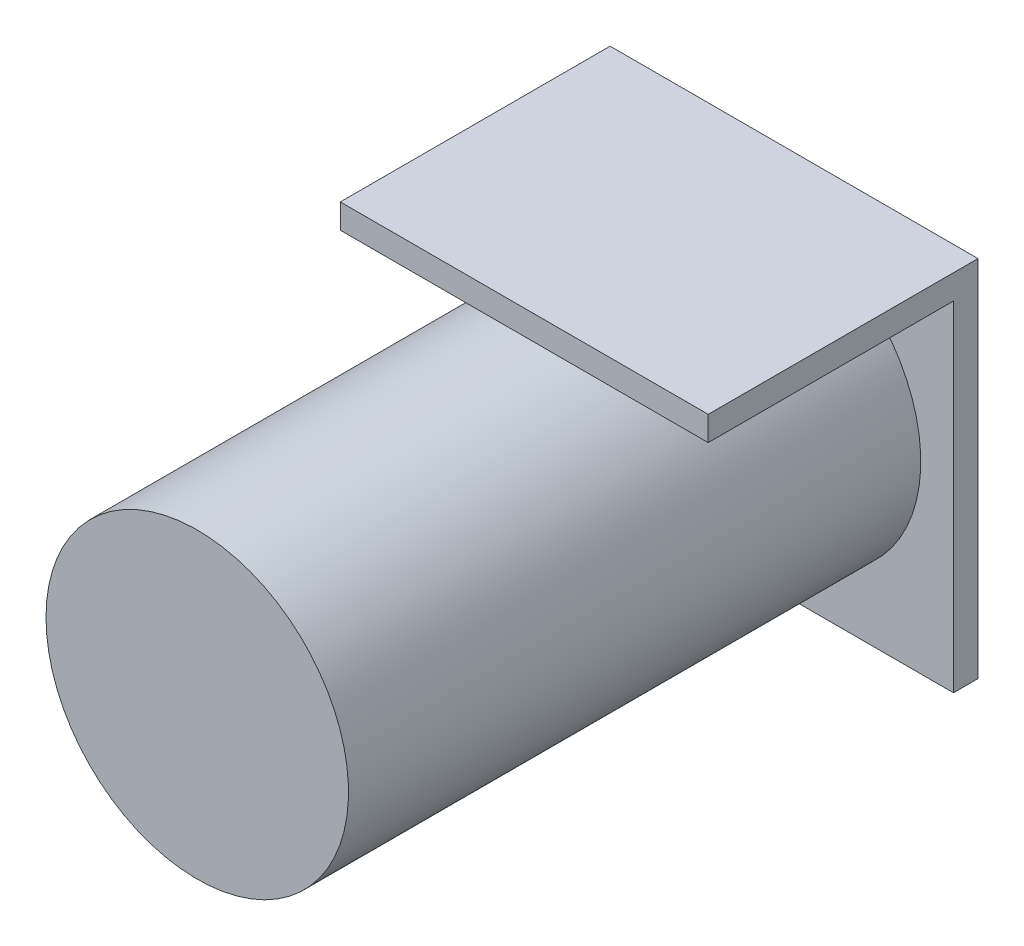
ISO-10303-21;
HEADER;
FILE_DESCRIPTION(('STEP AP214'),'2;1');
FILE_NAME('part.step','',(''),(''),'','','');
FILE_SCHEMA(('AUTOMOTIVE_DESIGN { 1 0 10303 214 1 1 1 1 }'));
ENDSEC;
DATA;
#1=APPLICATION_CONTEXT('core data for automotive mechanical design processes');
#2=APPLICATION_PROTOCOL_DEFINITION('international standard','automotive_design',2000,#1);
#3=PRODUCT_CONTEXT('',#1,'mechanical');
#4=PRODUCT('Part','Part','',(#3));
#5=PRODUCT_RELATED_PRODUCT_CATEGORY('part','',(#4));
#6=PRODUCT_DEFINITION_FORMATION('','',#4);
#7=PRODUCT_DEFINITION_CONTEXT('part definition',#1,'design');
#8=PRODUCT_DEFINITION('design','',#6,#7);
#9=PRODUCT_DEFINITION_SHAPE('','',#8);
#10=(LENGTH_UNIT() NAMED_UNIT(*) SI_UNIT(.MILLI.,.METRE.));
#11=(NAMED_UNIT(*) PLANE_ANGLE_UNIT() SI_UNIT($,.RADIAN.));
#12=(NAMED_UNIT(*) SI_UNIT($,.STERADIAN.) SOLID_ANGLE_UNIT());
#13=UNCERTAINTY_MEASURE_WITH_UNIT(LENGTH_MEASURE(1.E-05),#10,'distance_accuracy_value','');
#14=(GEOMETRIC_REPRESENTATION_CONTEXT(3) GLOBAL_UNCERTAINTY_ASSIGNED_CONTEXT((#13)) GLOBAL_UNIT_ASSIGNED_CONTEXT((#10,
#11,#12)) REPRESENTATION_CONTEXT('',''));
#15=CARTESIAN_POINT('',(0.,0.,0.));
#16=DIRECTION('',(0.,0.,1.));
#17=DIRECTION('',(1.,0.,0.));
#18=AXIS2_PLACEMENT_3D('',#15,#16,#17);
#19=CARTESIAN_POINT('',(22.5,-22.5,0.));
#20=DIRECTION('',(0.,0.,-1.));
#21=DIRECTION('',(-1.,0.,0.));
#22=AXIS2_PLACEMENT_3D('',#19,#20,#21);
#23=PLANE('',#22);
#24=CARTESIAN_POINT('',(0.,0.,0.));
#25=DIRECTION('',(0.,0.,-1.));
#26=DIRECTION('',(-1.,0.,0.));
#27=AXIS2_PLACEMENT_3D('',#24,#25,#26);
#28=CIRCLE('',#27,18.5);
#29=CARTESIAN_POINT('',(-18.5,0.,0.));
#30=VERTEX_POINT('',#29);
#31=EDGE_CURVE('E150',#30,#30,#28,.T.);
#32=ORIENTED_EDGE('',*,*,#31,.T.);
#33=EDGE_LOOP('',(#32));
#34=FACE_BOUND('',#33,.T.);
#35=DIRECTION('',(1.,0.,0.));
#36=VECTOR('',#35,1.);
#37=CARTESIAN_POINT('',(22.5,19.,0.));
#38=LINE('',#37,#36);
#39=CARTESIAN_POINT('',(-22.5,19.,0.));
#40=VERTEX_POINT('',#39);
#41=CARTESIAN_POINT('',(22.5,19.,0.));
#42=VERTEX_POINT('',#41);
#43=EDGE_CURVE('E11',#40,#42,#38,.T.);
#44=ORIENTED_EDGE('',*,*,#43,.F.);
#45=DIRECTION('',(0.,-1.,0.));
#46=VECTOR('',#45,1.);
#47=CARTESIAN_POINT('',(-22.5,-22.5,0.));
#48=LINE('',#47,#46);
#49=CARTESIAN_POINT('',(-22.5,-22.5,0.));
#50=VERTEX_POINT('',#49);
#51=EDGE_CURVE('E137',#40,#50,#48,.T.);
#52=ORIENTED_EDGE('',*,*,#51,.T.);
#53=DIRECTION('',(-1.,0.,0.));
#54=VECTOR('',#53,1.);
#55=CARTESIAN_POINT('',(22.5,-22.5,0.));
#56=LINE('',#55,#54);
#57=CARTESIAN_POINT('',(22.5,-22.5,0.));
#58=VERTEX_POINT('',#57);
#59=EDGE_CURVE('E136',#58,#50,#56,.T.);
#60=ORIENTED_EDGE('',*,*,#59,.F.);
#61=DIRECTION('',(0.,-1.,0.));
#62=VECTOR('',#61,1.);
#63=CARTESIAN_POINT('',(22.5,-22.5,0.));
#64=LINE('',#63,#62);
#65=EDGE_CURVE('E104',#42,#58,#64,.T.);
#66=ORIENTED_EDGE('',*,*,#65,.F.);
#67=EDGE_LOOP('',(#44,#52,#60,#66));
#68=FACE_BOUND('',#67,.T.);
#69=ADVANCED_FACE('F39',(#34,#68),#23,.F.);
#70=CARTESIAN_POINT('',(0.,0.,-23.));
#71=DIRECTION('',(0.,0.,-1.));
#72=DIRECTION('',(-1.,0.,0.));
#73=AXIS2_PLACEMENT_3D('',#70,#71,#72);
#74=CYLINDRICAL_SURFACE('',#73,3.);
#75=CARTESIAN_POINT('',(0.,0.,-18.));
#76=DIRECTION('',(0.,0.,-1.));
#77=DIRECTION('',(-1.,0.,0.));
#78=AXIS2_PLACEMENT_3D('',#75,#76,#77);
#79=CIRCLE('',#78,3.);
#80=CARTESIAN_POINT('',(-3.,0.,-18.));
#81=VERTEX_POINT('',#80);
#82=EDGE_CURVE('E147',#81,#81,#79,.T.);
#83=ORIENTED_EDGE('',*,*,#82,.F.);
#84=EDGE_LOOP('',(#83));
#85=FACE_BOUND('',#84,.T.);
#86=CARTESIAN_POINT('',(0.,0.,-3.));
#87=DIRECTION('',(0.,0.,1.));
#88=DIRECTION('',(1.,0.,0.));
#89=AXIS2_PLACEMENT_3D('',#86,#87,#88);
#90=CIRCLE('',#89,3.);
#91=CARTESIAN_POINT('',(3.,0.,-3.));
#92=VERTEX_POINT('',#91);
#93=EDGE_CURVE('E50',#92,#92,#90,.T.);
#94=ORIENTED_EDGE('',*,*,#93,.F.);
#95=EDGE_LOOP('',(#94));
#96=FACE_BOUND('',#95,.T.);
#97=ADVANCED_FACE('F160',(#85,#96),#74,.T.);
#98=CARTESIAN_POINT('',(0.,0.,-18.));
#99=DIRECTION('',(0.,0.,1.));
#100=DIRECTION('',(1.,0.,0.));
#101=AXIS2_PLACEMENT_3D('',#98,#99,#100);
#102=PLANE('',#101);
#103=ORIENTED_EDGE('',*,*,#82,.T.);
#104=EDGE_LOOP('',(#103));
#105=FACE_BOUND('',#104,.T.);
#106=ADVANCED_FACE('F41',(#105),#102,.F.);
#107=CARTESIAN_POINT('',(22.5,22.,-3.));
#108=DIRECTION('',(0.,0.,1.));
#109=DIRECTION('',(1.,0.,0.));
#110=AXIS2_PLACEMENT_3D('',#107,#108,#109);
#111=PLANE('',#110);
#112=DIRECTION('',(-1.,0.,0.));
#113=VECTOR('',#112,1.);
#114=CARTESIAN_POINT('',(22.5,22.,-3.));
#115=LINE('',#114,#113);
#116=CARTESIAN_POINT('',(22.5,22.,-3.));
#117=VERTEX_POINT('',#116);
#118=CARTESIAN_POINT('',(-22.5,22.,-3.));
#119=VERTEX_POINT('',#118);
#120=EDGE_CURVE('E142',#117,#119,#115,.T.);
#121=ORIENTED_EDGE('',*,*,#120,.F.);
#122=DIRECTION('',(0.,1.,0.));
#123=VECTOR('',#122,1.);
#124=CARTESIAN_POINT('',(22.5,22.,-3.));
#125=LINE('',#124,#123);
#126=CARTESIAN_POINT('',(22.5,-22.5,-3.));
#127=VERTEX_POINT('',#126);
#128=EDGE_CURVE('E82',#127,#117,#125,.T.);
#129=ORIENTED_EDGE('',*,*,#128,.F.);
#130=DIRECTION('',(-1.,0.,0.));
#131=VECTOR('',#130,1.);
#132=CARTESIAN_POINT('',(22.5,-22.5,-3.));
#133=LINE('',#132,#131);
#134=CARTESIAN_POINT('',(-22.5,-22.5,-3.));
#135=VERTEX_POINT('',#134);
#136=EDGE_CURVE('E134',#127,#135,#133,.T.);
#137=ORIENTED_EDGE('',*,*,#136,.T.);
#138=DIRECTION('',(0.,1.,0.));
#139=VECTOR('',#138,1.);
#140=CARTESIAN_POINT('',(-22.5,22.,-3.));
#141=LINE('',#140,#139);
#142=EDGE_CURVE('E111',#135,#119,#141,.T.);
#143=ORIENTED_EDGE('',*,*,#142,.T.);
#144=EDGE_LOOP('',(#121,#129,#137,#143));
#145=FACE_BOUND('',#144,.T.);
#146=ORIENTED_EDGE('',*,*,#93,.T.);
#147=EDGE_LOOP('',(#146));
#148=FACE_BOUND('',#147,.T.);
#149=ADVANCED_FACE('F154',(#145,#148),#111,.F.);
#150=CARTESIAN_POINT('',(22.5,22.,0.));
#151=DIRECTION('',(0.,-1.,0.));
#152=DIRECTION('',(0.,0.,-1.));
#153=AXIS2_PLACEMENT_3D('',#150,#151,#152);
#154=PLANE('',#153);
#155=DIRECTION('',(0.,0.,1.));
#156=VECTOR('',#155,1.);
#157=CARTESIAN_POINT('',(-22.5,22.,0.));
#158=LINE('',#157,#156);
#159=CARTESIAN_POINT('',(-22.5,22.,30.));
#160=VERTEX_POINT('',#159);
#161=EDGE_CURVE('E112',#119,#160,#158,.T.);
#162=ORIENTED_EDGE('',*,*,#161,.T.);
#163=DIRECTION('',(-1.,0.,0.));
#164=VECTOR('',#163,1.);
#165=CARTESIAN_POINT('',(22.5,22.,30.));
#166=LINE('',#165,#164);
#167=CARTESIAN_POINT('',(22.5,22.,30.));
#168=VERTEX_POINT('',#167);
#169=EDGE_CURVE('E107',#168,#160,#166,.T.);
#170=ORIENTED_EDGE('',*,*,#169,.F.);
#171=DIRECTION('',(0.,0.,1.));
#172=VECTOR('',#171,1.);
#173=CARTESIAN_POINT('',(22.5,22.,0.));
#174=LINE('',#173,#172);
#175=EDGE_CURVE('E92',#117,#168,#174,.T.);
#176=ORIENTED_EDGE('',*,*,#175,.F.);
#177=ORIENTED_EDGE('',*,*,#120,.T.);
#178=EDGE_LOOP('',(#162,#170,#176,#177));
#179=FACE_BOUND('',#178,.T.);
#180=ADVANCED_FACE('F108',(#179),#154,.F.);
#181=CARTESIAN_POINT('',(22.5,-22.5,-3.));
#182=DIRECTION('',(0.,1.,0.));
#183=DIRECTION('',(0.,0.,1.));
#184=AXIS2_PLACEMENT_3D('',#181,#182,#183);
#185=PLANE('',#184);
#186=DIRECTION('',(0.,0.,-1.));
#187=VECTOR('',#186,1.);
#188=CARTESIAN_POINT('',(-22.5,-22.5,-3.));
#189=LINE('',#188,#187);
#190=EDGE_CURVE('E80',#50,#135,#189,.T.);
#191=ORIENTED_EDGE('',*,*,#190,.T.);
#192=ORIENTED_EDGE('',*,*,#136,.F.);
#193=DIRECTION('',(0.,0.,-1.));
#194=VECTOR('',#193,1.);
#195=CARTESIAN_POINT('',(22.5,-22.5,-3.));
#196=LINE('',#195,#194);
#197=EDGE_CURVE('E62',#58,#127,#196,.T.);
#198=ORIENTED_EDGE('',*,*,#197,.F.);
#199=ORIENTED_EDGE('',*,*,#59,.T.);
#200=EDGE_LOOP('',(#191,#192,#198,#199));
#201=FACE_BOUND('',#200,.T.);
#202=ADVANCED_FACE('F184',(#201),#185,.F.);
#203=CARTESIAN_POINT('',(22.5,0.,0.));
#204=DIRECTION('',(-1.,0.,0.));
#205=DIRECTION('',(0.,0.,1.));
#206=AXIS2_PLACEMENT_3D('',#203,#204,#205);
#207=PLANE('',#206);
#208=ORIENTED_EDGE('',*,*,#175,.T.);
#209=DIRECTION('',(0.,-1.,0.));
#210=VECTOR('',#209,1.);
#211=CARTESIAN_POINT('',(22.5,19.,30.));
#212=LINE('',#211,#210);
#213=CARTESIAN_POINT('',(22.5,19.,30.));
#214=VERTEX_POINT('',#213);
#215=EDGE_CURVE('E99',#168,#214,#212,.T.);
#216=ORIENTED_EDGE('',*,*,#215,.T.);
#217=DIRECTION('',(0.,0.,-1.));
#218=VECTOR('',#217,1.);
#219=CARTESIAN_POINT('',(22.5,19.,-3.));
#220=LINE('',#219,#218);
#221=EDGE_CURVE('E118',#214,#42,#220,.T.);
#222=ORIENTED_EDGE('',*,*,#221,.T.);
#223=ORIENTED_EDGE('',*,*,#65,.T.);
#224=ORIENTED_EDGE('',*,*,#197,.T.);
#225=ORIENTED_EDGE('',*,*,#128,.T.);
#226=EDGE_LOOP('',(#208,#216,#222,#223,#224,#225));
#227=FACE_BOUND('',#226,.T.);
#228=ADVANCED_FACE('F100',(#227),#207,.F.);
#229=CARTESIAN_POINT('',(-22.5,0.,0.));
#230=DIRECTION('',(-1.,0.,0.));
#231=DIRECTION('',(0.,0.,1.));
#232=AXIS2_PLACEMENT_3D('',#229,#230,#231);
#233=PLANE('',#232);
#234=ORIENTED_EDGE('',*,*,#161,.F.);
#235=ORIENTED_EDGE('',*,*,#142,.F.);
#236=ORIENTED_EDGE('',*,*,#190,.F.);
#237=ORIENTED_EDGE('',*,*,#51,.F.);
#238=DIRECTION('',(0.,0.,-1.));
#239=VECTOR('',#238,1.);
#240=CARTESIAN_POINT('',(-22.5,19.,-3.));
#241=LINE('',#240,#239);
#242=CARTESIAN_POINT('',(-22.5,19.,30.));
#243=VERTEX_POINT('',#242);
#244=EDGE_CURVE('E122',#243,#40,#241,.T.);
#245=ORIENTED_EDGE('',*,*,#244,.F.);
#246=DIRECTION('',(0.,-1.,0.));
#247=VECTOR('',#246,1.);
#248=CARTESIAN_POINT('',(-22.5,19.,30.));
#249=LINE('',#248,#247);
#250=EDGE_CURVE('E121',#160,#243,#249,.T.);
#251=ORIENTED_EDGE('',*,*,#250,.F.);
#252=EDGE_LOOP('',(#234,#235,#236,#237,#245,#251));
#253=FACE_BOUND('',#252,.T.);
#254=ADVANCED_FACE('F178',(#253),#233,.T.);
#255=CARTESIAN_POINT('',(18.5,0.,70.));
#256=DIRECTION('',(0.,0.,-1.));
#257=DIRECTION('',(-1.,0.,0.));
#258=AXIS2_PLACEMENT_3D('',#255,#256,#257);
#259=PLANE('',#258);
#260=CARTESIAN_POINT('',(0.,0.,70.));
#261=DIRECTION('',(0.,0.,-1.));
#262=DIRECTION('',(-1.,0.,0.));
#263=AXIS2_PLACEMENT_3D('',#260,#261,#262);
#264=CIRCLE('',#263,18.5);
#265=CARTESIAN_POINT('',(-18.5,0.,70.));
#266=VERTEX_POINT('',#265);
#267=EDGE_CURVE('E145',#266,#266,#264,.T.);
#268=ORIENTED_EDGE('',*,*,#267,.F.);
#269=EDGE_LOOP('',(#268));
#270=FACE_BOUND('',#269,.T.);
#271=ADVANCED_FACE('F173',(#270),#259,.F.);
#272=CARTESIAN_POINT('',(0.,0.,-23.));
#273=DIRECTION('',(0.,0.,-1.));
#274=DIRECTION('',(-1.,0.,0.));
#275=AXIS2_PLACEMENT_3D('',#272,#273,#274);
#276=CYLINDRICAL_SURFACE('',#275,18.5);
#277=ORIENTED_EDGE('',*,*,#31,.F.);
#278=EDGE_LOOP('',(#277));
#279=FACE_BOUND('',#278,.T.);
#280=ORIENTED_EDGE('',*,*,#267,.T.);
#281=EDGE_LOOP('',(#280));
#282=FACE_BOUND('',#281,.T.);
#283=ADVANCED_FACE('F172',(#279,#282),#276,.T.);
#284=CARTESIAN_POINT('',(22.5,19.,-3.));
#285=DIRECTION('',(0.,1.,0.));
#286=DIRECTION('',(0.,0.,1.));
#287=AXIS2_PLACEMENT_3D('',#284,#285,#286);
#288=PLANE('',#287);
#289=ORIENTED_EDGE('',*,*,#244,.T.);
#290=ORIENTED_EDGE('',*,*,#43,.T.);
#291=ORIENTED_EDGE('',*,*,#221,.F.);
#292=DIRECTION('',(-1.,0.,0.));
#293=VECTOR('',#292,1.);
#294=CARTESIAN_POINT('',(22.5,19.,30.));
#295=LINE('',#294,#293);
#296=EDGE_CURVE('E113',#214,#243,#295,.T.);
#297=ORIENTED_EDGE('',*,*,#296,.T.);
#298=EDGE_LOOP('',(#289,#290,#291,#297));
#299=FACE_BOUND('',#298,.T.);
#300=ADVANCED_FACE('F171',(#299),#288,.F.);
#301=CARTESIAN_POINT('',(22.5,19.,30.));
#302=DIRECTION('',(0.,0.,-1.));
#303=DIRECTION('',(-1.,0.,0.));
#304=AXIS2_PLACEMENT_3D('',#301,#302,#303);
#305=PLANE('',#304);
#306=ORIENTED_EDGE('',*,*,#250,.T.);
#307=ORIENTED_EDGE('',*,*,#296,.F.);
#308=ORIENTED_EDGE('',*,*,#215,.F.);
#309=ORIENTED_EDGE('',*,*,#169,.T.);
#310=EDGE_LOOP('',(#306,#307,#308,#309));
#311=FACE_BOUND('',#310,.T.);
#312=ADVANCED_FACE('F120',(#311),#305,.F.);
#313=CLOSED_SHELL('',(#69,#97,#106,#149,#180,#202,#228,#254,#271,#283,#300,#312));
#314=MANIFOLD_SOLID_BREP('B2',#313);
#315=ADVANCED_BREP_SHAPE_REPRESENTATION('',(#18,#314),#14);
#316=SHAPE_DEFINITION_REPRESENTATION(#9,#315);
ENDSEC;
END-ISO-10303-21;
